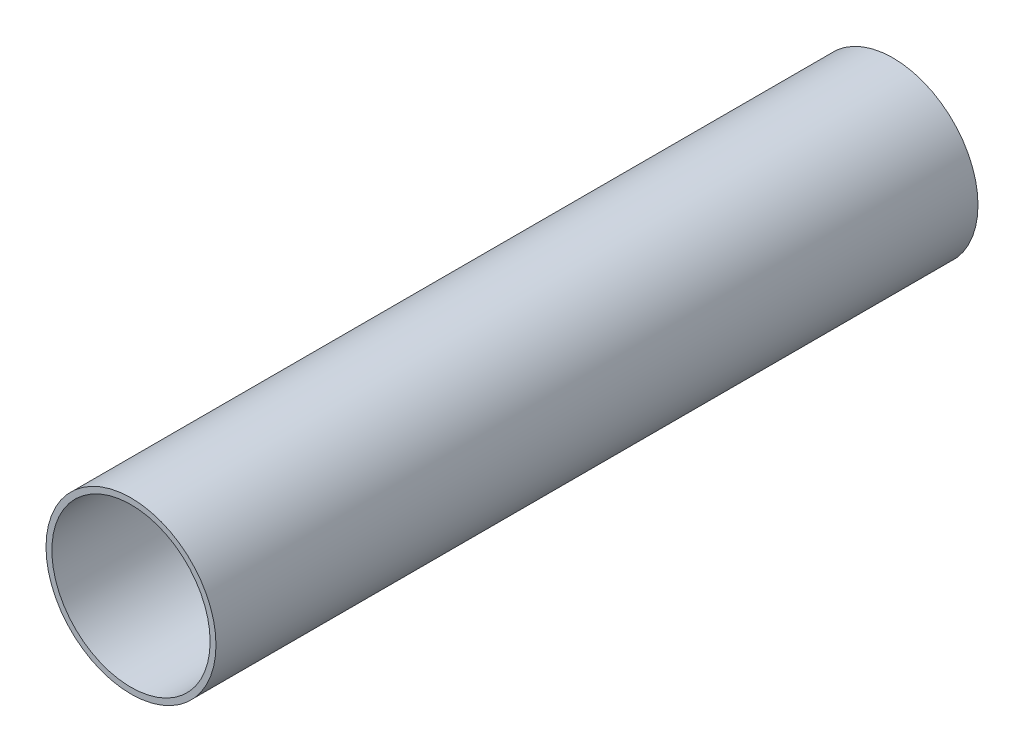
ISO-10303-21;
HEADER;
FILE_DESCRIPTION(('STEP AP214'),'2;1');
FILE_NAME('part.step','',(''),(''),'','','');
FILE_SCHEMA(('AUTOMOTIVE_DESIGN { 1 0 10303 214 1 1 1 1 }'));
ENDSEC;
DATA;
#1=APPLICATION_CONTEXT('core data for automotive mechanical design processes');
#2=APPLICATION_PROTOCOL_DEFINITION('international standard','automotive_design',2000,#1);
#3=PRODUCT_CONTEXT('',#1,'mechanical');
#4=PRODUCT('Part','Part','',(#3));
#5=PRODUCT_RELATED_PRODUCT_CATEGORY('part','',(#4));
#6=PRODUCT_DEFINITION_FORMATION('','',#4);
#7=PRODUCT_DEFINITION_CONTEXT('part definition',#1,'design');
#8=PRODUCT_DEFINITION('design','',#6,#7);
#9=PRODUCT_DEFINITION_SHAPE('','',#8);
#10=(LENGTH_UNIT() NAMED_UNIT(*) SI_UNIT(.MILLI.,.METRE.));
#11=(NAMED_UNIT(*) PLANE_ANGLE_UNIT() SI_UNIT($,.RADIAN.));
#12=(NAMED_UNIT(*) SI_UNIT($,.STERADIAN.) SOLID_ANGLE_UNIT());
#13=UNCERTAINTY_MEASURE_WITH_UNIT(LENGTH_MEASURE(1.E-05),#10,'distance_accuracy_value','');
#14=(GEOMETRIC_REPRESENTATION_CONTEXT(3) GLOBAL_UNCERTAINTY_ASSIGNED_CONTEXT((#13)) GLOBAL_UNIT_ASSIGNED_CONTEXT((#10,
#11,#12)) REPRESENTATION_CONTEXT('',''));
#15=CARTESIAN_POINT('',(0.,0.,0.));
#16=DIRECTION('',(0.,0.,1.));
#17=DIRECTION('',(1.,0.,0.));
#18=AXIS2_PLACEMENT_3D('',#15,#16,#17);
#19=CARTESIAN_POINT('',(0.,0.,260.));
#20=DIRECTION('',(0.,0.,1.));
#21=DIRECTION('',(1.,0.,0.));
#22=AXIS2_PLACEMENT_3D('',#19,#20,#21);
#23=PLANE('',#22);
#24=CARTESIAN_POINT('',(0.,0.,260.));
#25=DIRECTION('',(0.,0.,1.));
#26=DIRECTION('',(1.,0.,0.));
#27=AXIS2_PLACEMENT_3D('',#24,#25,#26);
#28=CIRCLE('',#27,29.);
#29=CARTESIAN_POINT('',(29.,0.,260.));
#30=VERTEX_POINT('',#29);
#31=EDGE_CURVE('E10',#30,#30,#28,.T.);
#32=ORIENTED_EDGE('',*,*,#31,.T.);
#33=EDGE_LOOP('',(#32));
#34=FACE_BOUND('',#33,.T.);
#35=CARTESIAN_POINT('',(0.,0.,260.));
#36=DIRECTION('',(0.,0.,1.));
#37=DIRECTION('',(1.,0.,0.));
#38=AXIS2_PLACEMENT_3D('',#35,#36,#37);
#39=CIRCLE('',#38,27.);
#40=CARTESIAN_POINT('',(27.,0.,260.));
#41=VERTEX_POINT('',#40);
#42=EDGE_CURVE('E42',#41,#41,#39,.T.);
#43=ORIENTED_EDGE('',*,*,#42,.F.);
#44=EDGE_LOOP('',(#43));
#45=FACE_BOUND('',#44,.T.);
#46=ADVANCED_FACE('F31',(#34,#45),#23,.T.);
#47=CARTESIAN_POINT('',(0.,0.,0.));
#48=DIRECTION('',(0.,0.,1.));
#49=DIRECTION('',(1.,0.,0.));
#50=AXIS2_PLACEMENT_3D('',#47,#48,#49);
#51=PLANE('',#50);
#52=CARTESIAN_POINT('',(0.,0.,0.));
#53=DIRECTION('',(0.,0.,1.));
#54=DIRECTION('',(1.,0.,0.));
#55=AXIS2_PLACEMENT_3D('',#52,#53,#54);
#56=CIRCLE('',#55,29.);
#57=CARTESIAN_POINT('',(29.,0.,0.));
#58=VERTEX_POINT('',#57);
#59=EDGE_CURVE('E35',#58,#58,#56,.T.);
#60=ORIENTED_EDGE('',*,*,#59,.F.);
#61=EDGE_LOOP('',(#60));
#62=FACE_BOUND('',#61,.T.);
#63=CARTESIAN_POINT('',(0.,0.,0.));
#64=DIRECTION('',(0.,0.,1.));
#65=DIRECTION('',(1.,0.,0.));
#66=AXIS2_PLACEMENT_3D('',#63,#64,#65);
#67=CIRCLE('',#66,27.);
#68=CARTESIAN_POINT('',(27.,0.,0.));
#69=VERTEX_POINT('',#68);
#70=EDGE_CURVE('E44',#69,#69,#67,.T.);
#71=ORIENTED_EDGE('',*,*,#70,.T.);
#72=EDGE_LOOP('',(#71));
#73=FACE_BOUND('',#72,.T.);
#74=ADVANCED_FACE('F54',(#62,#73),#51,.F.);
#75=CARTESIAN_POINT('',(0.,0.,260.));
#76=DIRECTION('',(0.,0.,-1.));
#77=DIRECTION('',(-1.,0.,0.));
#78=AXIS2_PLACEMENT_3D('',#75,#76,#77);
#79=CYLINDRICAL_SURFACE('',#78,29.);
#80=ORIENTED_EDGE('',*,*,#31,.F.);
#81=EDGE_LOOP('',(#80));
#82=FACE_BOUND('',#81,.T.);
#83=ORIENTED_EDGE('',*,*,#59,.T.);
#84=EDGE_LOOP('',(#83));
#85=FACE_BOUND('',#84,.T.);
#86=ADVANCED_FACE('F33',(#82,#85),#79,.T.);
#87=CARTESIAN_POINT('',(0.,0.,260.));
#88=DIRECTION('',(0.,0.,-1.));
#89=DIRECTION('',(-1.,0.,0.));
#90=AXIS2_PLACEMENT_3D('',#87,#88,#89);
#91=CYLINDRICAL_SURFACE('',#90,27.);
#92=ORIENTED_EDGE('',*,*,#42,.T.);
#93=EDGE_LOOP('',(#92));
#94=FACE_BOUND('',#93,.T.);
#95=ORIENTED_EDGE('',*,*,#70,.F.);
#96=EDGE_LOOP('',(#95));
#97=FACE_BOUND('',#96,.T.);
#98=ADVANCED_FACE('F50',(#94,#97),#91,.F.);
#99=CLOSED_SHELL('',(#46,#74,#86,#98));
#100=MANIFOLD_SOLID_BREP('B2',#99);
#101=ADVANCED_BREP_SHAPE_REPRESENTATION('',(#18,#100),#14);
#102=SHAPE_DEFINITION_REPRESENTATION(#9,#101);
ENDSEC;
END-ISO-10303-21;
